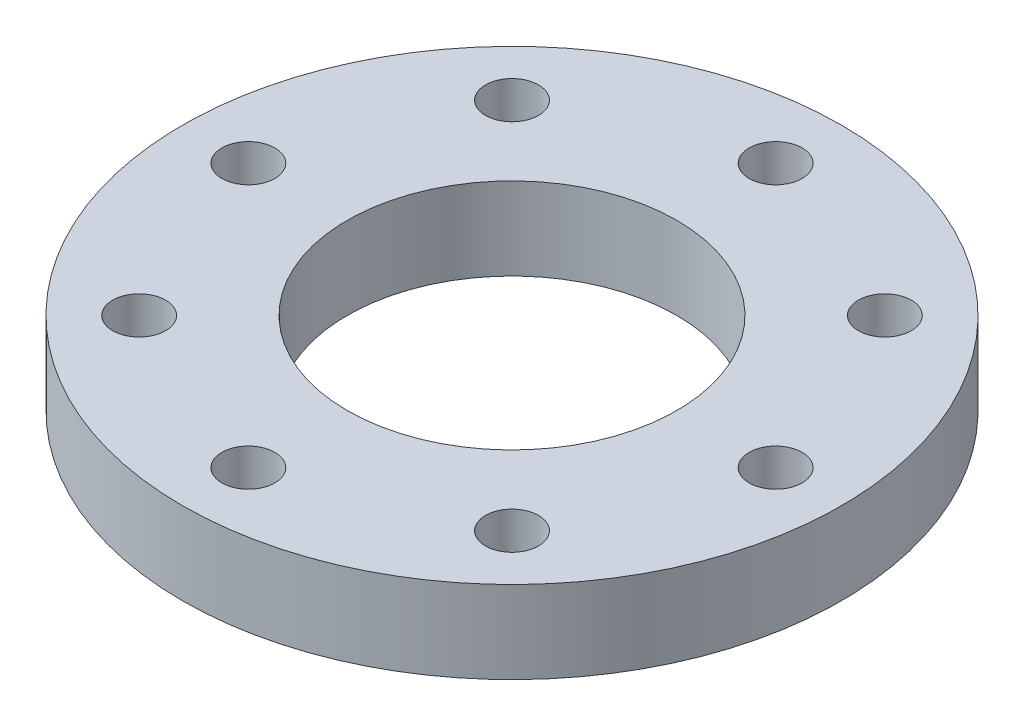
ISO-10303-21;
HEADER;
FILE_DESCRIPTION(('STEP AP214'),'2;1');
FILE_NAME('part.step','',(''),(''),'','','');
FILE_SCHEMA(('AUTOMOTIVE_DESIGN { 1 0 10303 214 1 1 1 1 }'));
ENDSEC;
DATA;
#1=APPLICATION_CONTEXT('core data for automotive mechanical design processes');
#2=APPLICATION_PROTOCOL_DEFINITION('international standard','automotive_design',2000,#1);
#3=PRODUCT_CONTEXT('',#1,'mechanical');
#4=PRODUCT('Part','Part','',(#3));
#5=PRODUCT_RELATED_PRODUCT_CATEGORY('part','',(#4));
#6=PRODUCT_DEFINITION_FORMATION('','',#4);
#7=PRODUCT_DEFINITION_CONTEXT('part definition',#1,'design');
#8=PRODUCT_DEFINITION('design','',#6,#7);
#9=PRODUCT_DEFINITION_SHAPE('','',#8);
#10=(LENGTH_UNIT() NAMED_UNIT(*) SI_UNIT(.MILLI.,.METRE.));
#11=(NAMED_UNIT(*) PLANE_ANGLE_UNIT() SI_UNIT($,.RADIAN.));
#12=(NAMED_UNIT(*) SI_UNIT($,.STERADIAN.) SOLID_ANGLE_UNIT());
#13=UNCERTAINTY_MEASURE_WITH_UNIT(LENGTH_MEASURE(1.E-05),#10,'distance_accuracy_value','');
#14=(GEOMETRIC_REPRESENTATION_CONTEXT(3) GLOBAL_UNCERTAINTY_ASSIGNED_CONTEXT((#13)) GLOBAL_UNIT_ASSIGNED_CONTEXT((#10,
#11,#12)) REPRESENTATION_CONTEXT('',''));
#15=CARTESIAN_POINT('',(0.,0.,0.));
#16=DIRECTION('',(0.,0.,1.));
#17=DIRECTION('',(1.,0.,0.));
#18=AXIS2_PLACEMENT_3D('',#15,#16,#17);
#19=CARTESIAN_POINT('',(0.,7.9375,0.));
#20=DIRECTION('',(0.,1.,0.));
#21=DIRECTION('',(0.,0.,1.));
#22=AXIS2_PLACEMENT_3D('',#19,#20,#21);
#23=PLANE('',#22);
#24=CARTESIAN_POINT('',(0.,7.9375,-25.4));
#25=DIRECTION('',(0.,1.,0.));
#26=DIRECTION('',(0.,0.,1.));
#27=AXIS2_PLACEMENT_3D('',#24,#25,#26);
#28=CIRCLE('',#27,2.55269999999999);
#29=CARTESIAN_POINT('',(0.,7.9375,-22.8473));
#30=VERTEX_POINT('',#29);
#31=EDGE_CURVE('E100',#30,#30,#28,.T.);
#32=ORIENTED_EDGE('',*,*,#31,.F.);
#33=EDGE_LOOP('',(#32));
#34=FACE_BOUND('',#33,.T.);
#35=CARTESIAN_POINT('',(17.9605122421383,7.9375,-17.9605122421383));
#36=DIRECTION('',(0.,1.,0.));
#37=DIRECTION('',(0.,0.,1.));
#38=AXIS2_PLACEMENT_3D('',#35,#36,#37);
#39=CIRCLE('',#38,2.55269999999999);
#40=CARTESIAN_POINT('',(17.9605122421383,7.9375,-15.4078122421383));
#41=VERTEX_POINT('',#40);
#42=EDGE_CURVE('E94',#41,#41,#39,.T.);
#43=ORIENTED_EDGE('',*,*,#42,.F.);
#44=EDGE_LOOP('',(#43));
#45=FACE_BOUND('',#44,.T.);
#46=CARTESIAN_POINT('',(25.4,7.9375,0.));
#47=DIRECTION('',(0.,1.,0.));
#48=DIRECTION('',(0.,0.,1.));
#49=AXIS2_PLACEMENT_3D('',#46,#47,#48);
#50=CIRCLE('',#49,2.55269999999999);
#51=CARTESIAN_POINT('',(25.4,7.9375,2.55269999999999));
#52=VERTEX_POINT('',#51);
#53=EDGE_CURVE('E88',#52,#52,#50,.T.);
#54=ORIENTED_EDGE('',*,*,#53,.F.);
#55=EDGE_LOOP('',(#54));
#56=FACE_BOUND('',#55,.T.);
#57=CARTESIAN_POINT('',(17.9605122421383,7.9375,17.9605122421383));
#58=DIRECTION('',(0.,1.,0.));
#59=DIRECTION('',(0.,0.,1.));
#60=AXIS2_PLACEMENT_3D('',#57,#58,#59);
#61=CIRCLE('',#60,2.55269999999999);
#62=CARTESIAN_POINT('',(17.9605122421383,7.9375,20.5132122421383));
#63=VERTEX_POINT('',#62);
#64=EDGE_CURVE('E82',#63,#63,#61,.T.);
#65=ORIENTED_EDGE('',*,*,#64,.F.);
#66=EDGE_LOOP('',(#65));
#67=FACE_BOUND('',#66,.T.);
#68=CARTESIAN_POINT('',(0.,7.9375,25.4));
#69=DIRECTION('',(0.,1.,0.));
#70=DIRECTION('',(0.,0.,1.));
#71=AXIS2_PLACEMENT_3D('',#68,#69,#70);
#72=CIRCLE('',#71,2.55269999999999);
#73=CARTESIAN_POINT('',(0.,7.9375,27.9527));
#74=VERTEX_POINT('',#73);
#75=EDGE_CURVE('E76',#74,#74,#72,.T.);
#76=ORIENTED_EDGE('',*,*,#75,.F.);
#77=EDGE_LOOP('',(#76));
#78=FACE_BOUND('',#77,.T.);
#79=CARTESIAN_POINT('',(-17.9605122421383,7.9375,17.9605122421383));
#80=DIRECTION('',(0.,1.,0.));
#81=DIRECTION('',(0.,0.,1.));
#82=AXIS2_PLACEMENT_3D('',#79,#80,#81);
#83=CIRCLE('',#82,2.55269999999999);
#84=CARTESIAN_POINT('',(-17.9605122421383,7.9375,20.5132122421383));
#85=VERTEX_POINT('',#84);
#86=EDGE_CURVE('E70',#85,#85,#83,.T.);
#87=ORIENTED_EDGE('',*,*,#86,.F.);
#88=EDGE_LOOP('',(#87));
#89=FACE_BOUND('',#88,.T.);
#90=CARTESIAN_POINT('',(-25.4,7.9375,0.));
#91=DIRECTION('',(0.,1.,0.));
#92=DIRECTION('',(0.,0.,1.));
#93=AXIS2_PLACEMENT_3D('',#90,#91,#92);
#94=CIRCLE('',#93,2.55269999999999);
#95=CARTESIAN_POINT('',(-25.4,7.9375,2.55269999999999));
#96=VERTEX_POINT('',#95);
#97=EDGE_CURVE('E64',#96,#96,#94,.T.);
#98=ORIENTED_EDGE('',*,*,#97,.F.);
#99=EDGE_LOOP('',(#98));
#100=FACE_BOUND('',#99,.T.);
#101=CARTESIAN_POINT('',(-17.9605122421383,7.9375,-17.9605122421383));
#102=DIRECTION('',(0.,1.,0.));
#103=DIRECTION('',(0.,0.,1.));
#104=AXIS2_PLACEMENT_3D('',#101,#102,#103);
#105=CIRCLE('',#104,2.55269999999999);
#106=CARTESIAN_POINT('',(-17.9605122421383,7.9375,-15.4078122421383));
#107=VERTEX_POINT('',#106);
#108=EDGE_CURVE('E58',#107,#107,#105,.T.);
#109=ORIENTED_EDGE('',*,*,#108,.F.);
#110=EDGE_LOOP('',(#109));
#111=FACE_BOUND('',#110,.T.);
#112=CARTESIAN_POINT('',(0.,7.9375,0.));
#113=DIRECTION('',(0.,1.,0.));
#114=DIRECTION('',(0.,0.,1.));
#115=AXIS2_PLACEMENT_3D('',#112,#113,#114);
#116=CIRCLE('',#115,31.75);
#117=CARTESIAN_POINT('',(0.,7.9375,31.75));
#118=VERTEX_POINT('',#117);
#119=EDGE_CURVE('E10',#118,#118,#116,.T.);
#120=ORIENTED_EDGE('',*,*,#119,.T.);
#121=EDGE_LOOP('',(#120));
#122=FACE_BOUND('',#121,.T.);
#123=CARTESIAN_POINT('',(0.,7.9375,0.));
#124=DIRECTION('',(0.,1.,0.));
#125=DIRECTION('',(0.,0.,1.));
#126=AXIS2_PLACEMENT_3D('',#123,#124,#125);
#127=CIRCLE('',#126,15.875);
#128=CARTESIAN_POINT('',(0.,7.9375,15.875));
#129=VERTEX_POINT('',#128);
#130=EDGE_CURVE('E48',#129,#129,#127,.T.);
#131=ORIENTED_EDGE('',*,*,#130,.F.);
#132=EDGE_LOOP('',(#131));
#133=FACE_BOUND('',#132,.T.);
#134=ADVANCED_FACE('F37',(#34,#45,#56,#67,#78,#89,#100,#111,#122,#133),#23,.T.);
#135=CARTESIAN_POINT('',(0.,0.,0.));
#136=DIRECTION('',(0.,1.,0.));
#137=DIRECTION('',(0.,0.,1.));
#138=AXIS2_PLACEMENT_3D('',#135,#136,#137);
#139=PLANE('',#138);
#140=CARTESIAN_POINT('',(0.,0.,-25.4));
#141=DIRECTION('',(0.,1.,0.));
#142=DIRECTION('',(0.,0.,1.));
#143=AXIS2_PLACEMENT_3D('',#140,#141,#142);
#144=CIRCLE('',#143,2.5527);
#145=CARTESIAN_POINT('',(0.,0.,-22.8473));
#146=VERTEX_POINT('',#145);
#147=EDGE_CURVE('E97',#146,#146,#144,.T.);
#148=ORIENTED_EDGE('',*,*,#147,.T.);
#149=EDGE_LOOP('',(#148));
#150=FACE_BOUND('',#149,.T.);
#151=CARTESIAN_POINT('',(17.9605122421383,0.,-17.9605122421383));
#152=DIRECTION('',(0.,1.,0.));
#153=DIRECTION('',(0.,0.,1.));
#154=AXIS2_PLACEMENT_3D('',#151,#152,#153);
#155=CIRCLE('',#154,2.5527);
#156=CARTESIAN_POINT('',(17.9605122421383,0.,-15.4078122421383));
#157=VERTEX_POINT('',#156);
#158=EDGE_CURVE('E91',#157,#157,#155,.T.);
#159=ORIENTED_EDGE('',*,*,#158,.T.);
#160=EDGE_LOOP('',(#159));
#161=FACE_BOUND('',#160,.T.);
#162=CARTESIAN_POINT('',(25.4,0.,0.));
#163=DIRECTION('',(0.,1.,0.));
#164=DIRECTION('',(0.,0.,1.));
#165=AXIS2_PLACEMENT_3D('',#162,#163,#164);
#166=CIRCLE('',#165,2.5527);
#167=CARTESIAN_POINT('',(25.4,0.,2.5527));
#168=VERTEX_POINT('',#167);
#169=EDGE_CURVE('E85',#168,#168,#166,.T.);
#170=ORIENTED_EDGE('',*,*,#169,.T.);
#171=EDGE_LOOP('',(#170));
#172=FACE_BOUND('',#171,.T.);
#173=CARTESIAN_POINT('',(17.9605122421383,0.,17.9605122421383));
#174=DIRECTION('',(0.,1.,0.));
#175=DIRECTION('',(0.,0.,1.));
#176=AXIS2_PLACEMENT_3D('',#173,#174,#175);
#177=CIRCLE('',#176,2.5527);
#178=CARTESIAN_POINT('',(17.9605122421383,0.,20.5132122421383));
#179=VERTEX_POINT('',#178);
#180=EDGE_CURVE('E79',#179,#179,#177,.T.);
#181=ORIENTED_EDGE('',*,*,#180,.T.);
#182=EDGE_LOOP('',(#181));
#183=FACE_BOUND('',#182,.T.);
#184=CARTESIAN_POINT('',(0.,0.,25.4));
#185=DIRECTION('',(0.,1.,0.));
#186=DIRECTION('',(0.,0.,1.));
#187=AXIS2_PLACEMENT_3D('',#184,#185,#186);
#188=CIRCLE('',#187,2.5527);
#189=CARTESIAN_POINT('',(0.,0.,27.9527));
#190=VERTEX_POINT('',#189);
#191=EDGE_CURVE('E73',#190,#190,#188,.T.);
#192=ORIENTED_EDGE('',*,*,#191,.T.);
#193=EDGE_LOOP('',(#192));
#194=FACE_BOUND('',#193,.T.);
#195=CARTESIAN_POINT('',(-17.9605122421383,0.,17.9605122421383));
#196=DIRECTION('',(0.,1.,0.));
#197=DIRECTION('',(0.,0.,1.));
#198=AXIS2_PLACEMENT_3D('',#195,#196,#197);
#199=CIRCLE('',#198,2.5527);
#200=CARTESIAN_POINT('',(-17.9605122421383,0.,20.5132122421383));
#201=VERTEX_POINT('',#200);
#202=EDGE_CURVE('E67',#201,#201,#199,.T.);
#203=ORIENTED_EDGE('',*,*,#202,.T.);
#204=EDGE_LOOP('',(#203));
#205=FACE_BOUND('',#204,.T.);
#206=CARTESIAN_POINT('',(-25.4,0.,0.));
#207=DIRECTION('',(0.,1.,0.));
#208=DIRECTION('',(0.,0.,1.));
#209=AXIS2_PLACEMENT_3D('',#206,#207,#208);
#210=CIRCLE('',#209,2.5527);
#211=CARTESIAN_POINT('',(-25.4,0.,2.5527));
#212=VERTEX_POINT('',#211);
#213=EDGE_CURVE('E61',#212,#212,#210,.T.);
#214=ORIENTED_EDGE('',*,*,#213,.T.);
#215=EDGE_LOOP('',(#214));
#216=FACE_BOUND('',#215,.T.);
#217=CARTESIAN_POINT('',(-17.9605122421383,0.,-17.9605122421383));
#218=DIRECTION('',(0.,1.,0.));
#219=DIRECTION('',(0.,0.,1.));
#220=AXIS2_PLACEMENT_3D('',#217,#218,#219);
#221=CIRCLE('',#220,2.5527);
#222=CARTESIAN_POINT('',(-17.9605122421383,0.,-15.4078122421383));
#223=VERTEX_POINT('',#222);
#224=EDGE_CURVE('E53',#223,#223,#221,.T.);
#225=ORIENTED_EDGE('',*,*,#224,.T.);
#226=EDGE_LOOP('',(#225));
#227=FACE_BOUND('',#226,.T.);
#228=CARTESIAN_POINT('',(0.,0.,0.));
#229=DIRECTION('',(0.,1.,0.));
#230=DIRECTION('',(0.,0.,1.));
#231=AXIS2_PLACEMENT_3D('',#228,#229,#230);
#232=CIRCLE('',#231,31.75);
#233=CARTESIAN_POINT('',(0.,0.,31.75));
#234=VERTEX_POINT('',#233);
#235=EDGE_CURVE('E41',#234,#234,#232,.T.);
#236=ORIENTED_EDGE('',*,*,#235,.F.);
#237=EDGE_LOOP('',(#236));
#238=FACE_BOUND('',#237,.T.);
#239=CARTESIAN_POINT('',(0.,0.,0.));
#240=DIRECTION('',(0.,1.,0.));
#241=DIRECTION('',(0.,0.,1.));
#242=AXIS2_PLACEMENT_3D('',#239,#240,#241);
#243=CIRCLE('',#242,15.875);
#244=CARTESIAN_POINT('',(0.,0.,15.875));
#245=VERTEX_POINT('',#244);
#246=EDGE_CURVE('E50',#245,#245,#243,.T.);
#247=ORIENTED_EDGE('',*,*,#246,.T.);
#248=EDGE_LOOP('',(#247));
#249=FACE_BOUND('',#248,.T.);
#250=ADVANCED_FACE('F108',(#150,#161,#172,#183,#194,#205,#216,#227,#238,#249),#139,.F.);
#251=CARTESIAN_POINT('',(0.,7.9375,0.));
#252=DIRECTION('',(0.,-1.,0.));
#253=DIRECTION('',(0.,0.,-1.));
#254=AXIS2_PLACEMENT_3D('',#251,#252,#253);
#255=CYLINDRICAL_SURFACE('',#254,31.75);
#256=ORIENTED_EDGE('',*,*,#119,.F.);
#257=EDGE_LOOP('',(#256));
#258=FACE_BOUND('',#257,.T.);
#259=ORIENTED_EDGE('',*,*,#235,.T.);
#260=EDGE_LOOP('',(#259));
#261=FACE_BOUND('',#260,.T.);
#262=ADVANCED_FACE('F39',(#258,#261),#255,.T.);
#263=CARTESIAN_POINT('',(0.,7.9375,0.));
#264=DIRECTION('',(0.,-1.,0.));
#265=DIRECTION('',(0.,0.,-1.));
#266=AXIS2_PLACEMENT_3D('',#263,#264,#265);
#267=CYLINDRICAL_SURFACE('',#266,15.875);
#268=ORIENTED_EDGE('',*,*,#130,.T.);
#269=EDGE_LOOP('',(#268));
#270=FACE_BOUND('',#269,.T.);
#271=ORIENTED_EDGE('',*,*,#246,.F.);
#272=EDGE_LOOP('',(#271));
#273=FACE_BOUND('',#272,.T.);
#274=ADVANCED_FACE('F126',(#270,#273),#267,.F.);
#275=CARTESIAN_POINT('',(-17.9605122421383,7.9375,-17.9605122421383));
#276=DIRECTION('',(0.,1.,0.));
#277=DIRECTION('',(0.,0.,1.));
#278=AXIS2_PLACEMENT_3D('',#275,#276,#277);
#279=CYLINDRICAL_SURFACE('',#278,2.55269999999999);
#280=ORIENTED_EDGE('',*,*,#224,.F.);
#281=EDGE_LOOP('',(#280));
#282=FACE_BOUND('',#281,.T.);
#283=ORIENTED_EDGE('',*,*,#108,.T.);
#284=EDGE_LOOP('',(#283));
#285=FACE_BOUND('',#284,.T.);
#286=ADVANCED_FACE('F129',(#282,#285),#279,.F.);
#287=CARTESIAN_POINT('',(-25.4,7.9375,0.));
#288=DIRECTION('',(0.,1.,0.));
#289=DIRECTION('',(0.,0.,1.));
#290=AXIS2_PLACEMENT_3D('',#287,#288,#289);
#291=CYLINDRICAL_SURFACE('',#290,2.55269999999999);
#292=ORIENTED_EDGE('',*,*,#213,.F.);
#293=EDGE_LOOP('',(#292));
#294=FACE_BOUND('',#293,.T.);
#295=ORIENTED_EDGE('',*,*,#97,.T.);
#296=EDGE_LOOP('',(#295));
#297=FACE_BOUND('',#296,.T.);
#298=ADVANCED_FACE('F143',(#294,#297),#291,.F.);
#299=CARTESIAN_POINT('',(-17.9605122421383,7.9375,17.9605122421383));
#300=DIRECTION('',(0.,1.,0.));
#301=DIRECTION('',(0.,0.,1.));
#302=AXIS2_PLACEMENT_3D('',#299,#300,#301);
#303=CYLINDRICAL_SURFACE('',#302,2.55269999999999);
#304=ORIENTED_EDGE('',*,*,#202,.F.);
#305=EDGE_LOOP('',(#304));
#306=FACE_BOUND('',#305,.T.);
#307=ORIENTED_EDGE('',*,*,#86,.T.);
#308=EDGE_LOOP('',(#307));
#309=FACE_BOUND('',#308,.T.);
#310=ADVANCED_FACE('F147',(#306,#309),#303,.F.);
#311=CARTESIAN_POINT('',(0.,7.9375,25.4));
#312=DIRECTION('',(0.,1.,0.));
#313=DIRECTION('',(0.,0.,1.));
#314=AXIS2_PLACEMENT_3D('',#311,#312,#313);
#315=CYLINDRICAL_SURFACE('',#314,2.55269999999999);
#316=ORIENTED_EDGE('',*,*,#191,.F.);
#317=EDGE_LOOP('',(#316));
#318=FACE_BOUND('',#317,.T.);
#319=ORIENTED_EDGE('',*,*,#75,.T.);
#320=EDGE_LOOP('',(#319));
#321=FACE_BOUND('',#320,.T.);
#322=ADVANCED_FACE('F151',(#318,#321),#315,.F.);
#323=CARTESIAN_POINT('',(17.9605122421383,7.9375,17.9605122421383));
#324=DIRECTION('',(0.,1.,0.));
#325=DIRECTION('',(0.,0.,1.));
#326=AXIS2_PLACEMENT_3D('',#323,#324,#325);
#327=CYLINDRICAL_SURFACE('',#326,2.55269999999999);
#328=ORIENTED_EDGE('',*,*,#180,.F.);
#329=EDGE_LOOP('',(#328));
#330=FACE_BOUND('',#329,.T.);
#331=ORIENTED_EDGE('',*,*,#64,.T.);
#332=EDGE_LOOP('',(#331));
#333=FACE_BOUND('',#332,.T.);
#334=ADVANCED_FACE('F155',(#330,#333),#327,.F.);
#335=CARTESIAN_POINT('',(25.4,7.9375,0.));
#336=DIRECTION('',(0.,1.,0.));
#337=DIRECTION('',(0.,0.,1.));
#338=AXIS2_PLACEMENT_3D('',#335,#336,#337);
#339=CYLINDRICAL_SURFACE('',#338,2.55269999999999);
#340=ORIENTED_EDGE('',*,*,#169,.F.);
#341=EDGE_LOOP('',(#340));
#342=FACE_BOUND('',#341,.T.);
#343=ORIENTED_EDGE('',*,*,#53,.T.);
#344=EDGE_LOOP('',(#343));
#345=FACE_BOUND('',#344,.T.);
#346=ADVANCED_FACE('F159',(#342,#345),#339,.F.);
#347=CARTESIAN_POINT('',(17.9605122421383,7.9375,-17.9605122421383));
#348=DIRECTION('',(0.,1.,0.));
#349=DIRECTION('',(0.,0.,1.));
#350=AXIS2_PLACEMENT_3D('',#347,#348,#349);
#351=CYLINDRICAL_SURFACE('',#350,2.55269999999999);
#352=ORIENTED_EDGE('',*,*,#158,.F.);
#353=EDGE_LOOP('',(#352));
#354=FACE_BOUND('',#353,.T.);
#355=ORIENTED_EDGE('',*,*,#42,.T.);
#356=EDGE_LOOP('',(#355));
#357=FACE_BOUND('',#356,.T.);
#358=ADVANCED_FACE('F163',(#354,#357),#351,.F.);
#359=CARTESIAN_POINT('',(0.,7.9375,-25.4));
#360=DIRECTION('',(0.,1.,0.));
#361=DIRECTION('',(0.,0.,1.));
#362=AXIS2_PLACEMENT_3D('',#359,#360,#361);
#363=CYLINDRICAL_SURFACE('',#362,2.55269999999999);
#364=ORIENTED_EDGE('',*,*,#147,.F.);
#365=EDGE_LOOP('',(#364));
#366=FACE_BOUND('',#365,.T.);
#367=ORIENTED_EDGE('',*,*,#31,.T.);
#368=EDGE_LOOP('',(#367));
#369=FACE_BOUND('',#368,.T.);
#370=ADVANCED_FACE('F104',(#366,#369),#363,.F.);
#371=CLOSED_SHELL('',(#134,#250,#262,#274,#286,#298,#310,#322,#334,#346,#358,#370));
#372=MANIFOLD_SOLID_BREP('B2',#371);
#373=ADVANCED_BREP_SHAPE_REPRESENTATION('',(#18,#372),#14);
#374=SHAPE_DEFINITION_REPRESENTATION(#9,#373);
ENDSEC;
END-ISO-10303-21;
